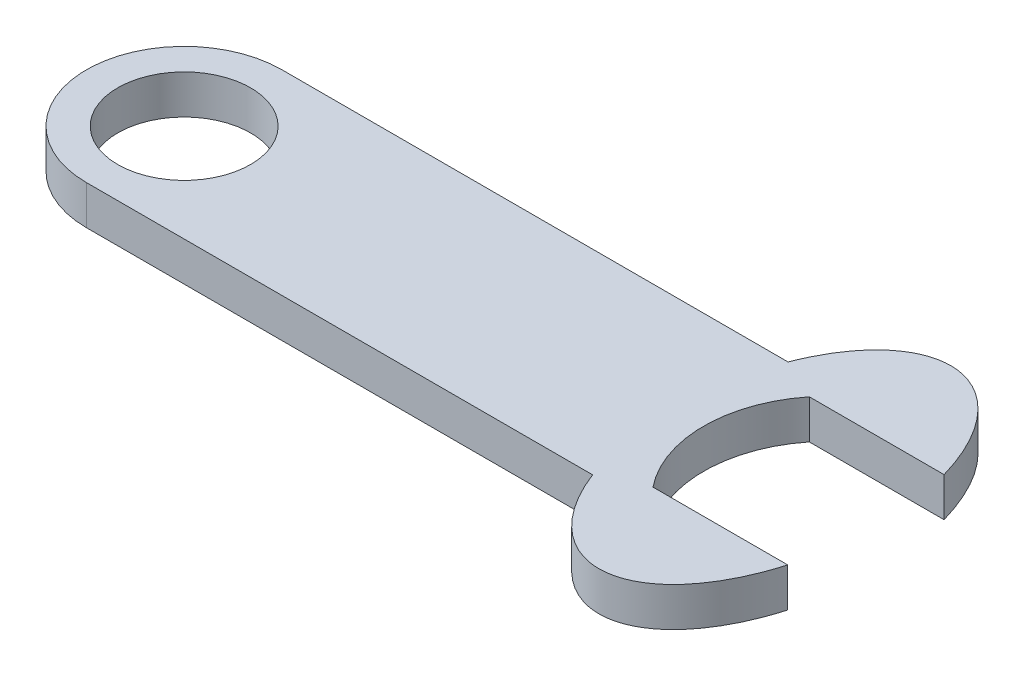
ISO-10303-21;
HEADER;
FILE_DESCRIPTION(('STEP AP214'),'2;1');
FILE_NAME('part.step','',(''),(''),'','','');
FILE_SCHEMA(('AUTOMOTIVE_DESIGN { 1 0 10303 214 1 1 1 1 }'));
ENDSEC;
DATA;
#1=APPLICATION_CONTEXT('core data for automotive mechanical design processes');
#2=APPLICATION_PROTOCOL_DEFINITION('international standard','automotive_design',2000,#1);
#3=PRODUCT_CONTEXT('',#1,'mechanical');
#4=PRODUCT('Part','Part','',(#3));
#5=PRODUCT_RELATED_PRODUCT_CATEGORY('part','',(#4));
#6=PRODUCT_DEFINITION_FORMATION('','',#4);
#7=PRODUCT_DEFINITION_CONTEXT('part definition',#1,'design');
#8=PRODUCT_DEFINITION('design','',#6,#7);
#9=PRODUCT_DEFINITION_SHAPE('','',#8);
#10=(LENGTH_UNIT() NAMED_UNIT(*) SI_UNIT(.MILLI.,.METRE.));
#11=(NAMED_UNIT(*) PLANE_ANGLE_UNIT() SI_UNIT($,.RADIAN.));
#12=(NAMED_UNIT(*) SI_UNIT($,.STERADIAN.) SOLID_ANGLE_UNIT());
#13=UNCERTAINTY_MEASURE_WITH_UNIT(LENGTH_MEASURE(1.E-05),#10,'distance_accuracy_value','');
#14=(GEOMETRIC_REPRESENTATION_CONTEXT(3) GLOBAL_UNCERTAINTY_ASSIGNED_CONTEXT((#13)) GLOBAL_UNIT_ASSIGNED_CONTEXT((#10,
#11,#12)) REPRESENTATION_CONTEXT('',''));
#15=CARTESIAN_POINT('',(0.,0.,0.));
#16=DIRECTION('',(0.,0.,1.));
#17=DIRECTION('',(1.,0.,0.));
#18=AXIS2_PLACEMENT_3D('',#15,#16,#17);
#19=CARTESIAN_POINT('',(0.,10.,0.));
#20=DIRECTION('',(0.,1.,0.));
#21=DIRECTION('',(0.,0.,1.));
#22=AXIS2_PLACEMENT_3D('',#19,#20,#21);
#23=PLANE('',#22);
#24=CARTESIAN_POINT('',(0.,10.,0.));
#25=DIRECTION('',(0.,1.,0.));
#26=DIRECTION('',(0.,0.,1.));
#27=AXIS2_PLACEMENT_3D('',#24,#25,#26);
#28=ELLIPSE('',#27,45.,26.);
#29=CARTESIAN_POINT('',(-21.6184649013605,10.,25.));
#30=VERTEX_POINT('',#29);
#31=CARTESIAN_POINT('',(23.290966828418,10.,20.));
#32=VERTEX_POINT('',#31);
#33=EDGE_CURVE('E152',#30,#32,#28,.T.);
#34=ORIENTED_EDGE('',*,*,#33,.T.);
#35=DIRECTION('',(-1.,0.,0.));
#36=VECTOR('',#35,1.);
#37=CARTESIAN_POINT('',(-11.1799919935936,10.,20.));
#38=LINE('',#37,#36);
#39=CARTESIAN_POINT('',(-11.1799919935936,10.,20.));
#40=VERTEX_POINT('',#39);
#41=EDGE_CURVE('E100',#32,#40,#38,.T.);
#42=ORIENTED_EDGE('',*,*,#41,.T.);
#43=CARTESIAN_POINT('',(13.8,10.,0.));
#44=DIRECTION('',(0.,-1.,0.));
#45=DIRECTION('',(0.,0.,1.));
#46=AXIS2_PLACEMENT_3D('',#43,#44,#45);
#47=CIRCLE('',#46,32.);
#48=CARTESIAN_POINT('',(-11.1799919935936,10.,-20.));
#49=VERTEX_POINT('',#48);
#50=EDGE_CURVE('E167',#40,#49,#47,.T.);
#51=ORIENTED_EDGE('',*,*,#50,.T.);
#52=DIRECTION('',(1.,0.,0.));
#53=VECTOR('',#52,1.);
#54=CARTESIAN_POINT('',(-11.1799919935936,10.,-20.));
#55=LINE('',#54,#53);
#56=CARTESIAN_POINT('',(23.290966828418,10.,-20.));
#57=VERTEX_POINT('',#56);
#58=EDGE_CURVE('E180',#49,#57,#55,.T.);
#59=ORIENTED_EDGE('',*,*,#58,.T.);
#60=CARTESIAN_POINT('',(0.,10.,0.));
#61=DIRECTION('',(0.,1.,0.));
#62=DIRECTION('',(0.,0.,1.));
#63=AXIS2_PLACEMENT_3D('',#60,#61,#62);
#64=ELLIPSE('',#63,45.,26.);
#65=CARTESIAN_POINT('',(-21.6184649013605,10.,-25.));
#66=VERTEX_POINT('',#65);
#67=EDGE_CURVE('E119',#57,#66,#64,.T.);
#68=ORIENTED_EDGE('',*,*,#67,.T.);
#69=DIRECTION('',(-1.,0.,0.));
#70=VECTOR('',#69,1.);
#71=CARTESIAN_POINT('',(-151.1,10.,-25.));
#72=LINE('',#71,#70);
#73=CARTESIAN_POINT('',(-151.1,10.,-25.));
#74=VERTEX_POINT('',#73);
#75=EDGE_CURVE('E113',#66,#74,#72,.T.);
#76=ORIENTED_EDGE('',*,*,#75,.T.);
#77=CARTESIAN_POINT('',(-151.1,10.,0.));
#78=DIRECTION('',(0.,1.,0.));
#79=DIRECTION('',(0.,0.,1.));
#80=AXIS2_PLACEMENT_3D('',#77,#78,#79);
#81=CIRCLE('',#80,25.);
#82=CARTESIAN_POINT('',(-151.1,10.,25.));
#83=VERTEX_POINT('',#82);
#84=EDGE_CURVE('E117',#74,#83,#81,.T.);
#85=ORIENTED_EDGE('',*,*,#84,.T.);
#86=DIRECTION('',(1.,0.,0.));
#87=VECTOR('',#86,1.);
#88=CARTESIAN_POINT('',(-151.1,10.,25.));
#89=LINE('',#88,#87);
#90=EDGE_CURVE('E57',#83,#30,#89,.T.);
#91=ORIENTED_EDGE('',*,*,#90,.T.);
#92=EDGE_LOOP('',(#34,#42,#51,#59,#68,#76,#85,#91));
#93=FACE_BOUND('',#92,.T.);
#94=CARTESIAN_POINT('',(-151.1,10.,0.));
#95=DIRECTION('',(0.,1.,0.));
#96=DIRECTION('',(0.,0.,1.));
#97=AXIS2_PLACEMENT_3D('',#94,#95,#96);
#98=CIRCLE('',#97,17.);
#99=CARTESIAN_POINT('',(-151.1,10.,17.));
#100=VERTEX_POINT('',#99);
#101=EDGE_CURVE('E141',#100,#100,#98,.T.);
#102=ORIENTED_EDGE('',*,*,#101,.F.);
#103=EDGE_LOOP('',(#102));
#104=FACE_BOUND('',#103,.T.);
#105=ADVANCED_FACE('F39',(#93,#104),#23,.T.);
#106=CARTESIAN_POINT('',(0.,0.,0.));
#107=DIRECTION('',(0.,1.,0.));
#108=DIRECTION('',(0.,0.,1.));
#109=AXIS2_PLACEMENT_3D('',#106,#107,#108);
#110=PLANE('',#109);
#111=CARTESIAN_POINT('',(0.,0.,0.));
#112=DIRECTION('',(0.,1.,0.));
#113=DIRECTION('',(0.,0.,1.));
#114=AXIS2_PLACEMENT_3D('',#111,#112,#113);
#115=ELLIPSE('',#114,45.,26.);
#116=CARTESIAN_POINT('',(-21.6184649013605,0.,25.));
#117=VERTEX_POINT('',#116);
#118=CARTESIAN_POINT('',(23.290966828418,0.,20.));
#119=VERTEX_POINT('',#118);
#120=EDGE_CURVE('E137',#117,#119,#115,.T.);
#121=ORIENTED_EDGE('',*,*,#120,.F.);
#122=DIRECTION('',(1.,0.,0.));
#123=VECTOR('',#122,1.);
#124=CARTESIAN_POINT('',(-151.1,0.,25.));
#125=LINE('',#124,#123);
#126=CARTESIAN_POINT('',(-151.1,0.,25.));
#127=VERTEX_POINT('',#126);
#128=EDGE_CURVE('E92',#127,#117,#125,.T.);
#129=ORIENTED_EDGE('',*,*,#128,.F.);
#130=CARTESIAN_POINT('',(-151.1,0.,0.));
#131=DIRECTION('',(0.,1.,0.));
#132=DIRECTION('',(0.,0.,1.));
#133=AXIS2_PLACEMENT_3D('',#130,#131,#132);
#134=CIRCLE('',#133,25.);
#135=CARTESIAN_POINT('',(-151.1,0.,-25.));
#136=VERTEX_POINT('',#135);
#137=EDGE_CURVE('E86',#136,#127,#134,.T.);
#138=ORIENTED_EDGE('',*,*,#137,.F.);
#139=DIRECTION('',(-1.,0.,0.));
#140=VECTOR('',#139,1.);
#141=CARTESIAN_POINT('',(-151.1,0.,-25.));
#142=LINE('',#141,#140);
#143=CARTESIAN_POINT('',(-21.6184649013605,0.,-25.));
#144=VERTEX_POINT('',#143);
#145=EDGE_CURVE('E127',#144,#136,#142,.T.);
#146=ORIENTED_EDGE('',*,*,#145,.F.);
#147=CARTESIAN_POINT('',(0.,0.,0.));
#148=DIRECTION('',(0.,1.,0.));
#149=DIRECTION('',(0.,0.,1.));
#150=AXIS2_PLACEMENT_3D('',#147,#148,#149);
#151=ELLIPSE('',#150,45.,26.);
#152=CARTESIAN_POINT('',(23.290966828418,0.,-20.));
#153=VERTEX_POINT('',#152);
#154=EDGE_CURVE('E147',#153,#144,#151,.T.);
#155=ORIENTED_EDGE('',*,*,#154,.F.);
#156=DIRECTION('',(1.,0.,0.));
#157=VECTOR('',#156,1.);
#158=CARTESIAN_POINT('',(-11.1799919935936,0.,-20.));
#159=LINE('',#158,#157);
#160=CARTESIAN_POINT('',(-11.1799919935936,0.,-20.));
#161=VERTEX_POINT('',#160);
#162=EDGE_CURVE('E145',#161,#153,#159,.T.);
#163=ORIENTED_EDGE('',*,*,#162,.F.);
#164=CARTESIAN_POINT('',(13.8,0.,0.));
#165=DIRECTION('',(0.,-1.,0.));
#166=DIRECTION('',(0.,0.,1.));
#167=AXIS2_PLACEMENT_3D('',#164,#165,#166);
#168=CIRCLE('',#167,32.);
#169=CARTESIAN_POINT('',(-11.1799919935936,0.,20.));
#170=VERTEX_POINT('',#169);
#171=EDGE_CURVE('E143',#170,#161,#168,.T.);
#172=ORIENTED_EDGE('',*,*,#171,.F.);
#173=DIRECTION('',(-1.,0.,0.));
#174=VECTOR('',#173,1.);
#175=CARTESIAN_POINT('',(-11.1799919935936,0.,20.));
#176=LINE('',#175,#174);
#177=EDGE_CURVE('E140',#119,#170,#176,.T.);
#178=ORIENTED_EDGE('',*,*,#177,.F.);
#179=EDGE_LOOP('',(#121,#129,#138,#146,#155,#163,#172,#178));
#180=FACE_BOUND('',#179,.T.);
#181=CARTESIAN_POINT('',(-151.1,0.,0.));
#182=DIRECTION('',(0.,1.,0.));
#183=DIRECTION('',(0.,0.,1.));
#184=AXIS2_PLACEMENT_3D('',#181,#182,#183);
#185=CIRCLE('',#184,17.);
#186=CARTESIAN_POINT('',(-151.1,0.,17.));
#187=VERTEX_POINT('',#186);
#188=EDGE_CURVE('E280',#187,#187,#185,.T.);
#189=ORIENTED_EDGE('',*,*,#188,.T.);
#190=EDGE_LOOP('',(#189));
#191=FACE_BOUND('',#190,.T.);
#192=ADVANCED_FACE('F171',(#180,#191),#110,.F.);
#193=DIRECTION('',(0.,-1.,0.));
#194=VECTOR('',#193,1.);
#195=SURFACE_OF_LINEAR_EXTRUSION('',#28,#194);
#196=ORIENTED_EDGE('',*,*,#120,.T.);
#197=DIRECTION('',(0.,-1.,0.));
#198=VECTOR('',#197,1.);
#199=CARTESIAN_POINT('',(23.290966828418,10.,20.));
#200=LINE('',#199,#198);
#201=EDGE_CURVE('E11',#32,#119,#200,.T.);
#202=ORIENTED_EDGE('',*,*,#201,.F.);
#203=ORIENTED_EDGE('',*,*,#33,.F.);
#204=DIRECTION('',(0.,-1.,0.));
#205=VECTOR('',#204,1.);
#206=CARTESIAN_POINT('',(-21.6184649013605,10.,25.));
#207=LINE('',#206,#205);
#208=EDGE_CURVE('E133',#30,#117,#207,.T.);
#209=ORIENTED_EDGE('',*,*,#208,.T.);
#210=EDGE_LOOP('',(#196,#202,#203,#209));
#211=FACE_BOUND('',#210,.T.);
#212=ADVANCED_FACE('F41',(#211),#195,.F.);
#213=CARTESIAN_POINT('',(-11.1799919935936,10.,20.));
#214=DIRECTION('',(0.,0.,1.));
#215=DIRECTION('',(1.,0.,0.));
#216=AXIS2_PLACEMENT_3D('',#213,#214,#215);
#217=PLANE('',#216);
#218=ORIENTED_EDGE('',*,*,#177,.T.);
#219=DIRECTION('',(0.,-1.,0.));
#220=VECTOR('',#219,1.);
#221=CARTESIAN_POINT('',(-11.1799919935936,10.,20.));
#222=LINE('',#221,#220);
#223=EDGE_CURVE('E49',#40,#170,#222,.T.);
#224=ORIENTED_EDGE('',*,*,#223,.F.);
#225=ORIENTED_EDGE('',*,*,#41,.F.);
#226=ORIENTED_EDGE('',*,*,#201,.T.);
#227=EDGE_LOOP('',(#218,#224,#225,#226));
#228=FACE_BOUND('',#227,.T.);
#229=ADVANCED_FACE('F192',(#228),#217,.F.);
#230=CARTESIAN_POINT('',(13.8,10.,0.));
#231=DIRECTION('',(0.,-1.,0.));
#232=DIRECTION('',(0.,0.,-1.));
#233=AXIS2_PLACEMENT_3D('',#230,#231,#232);
#234=CYLINDRICAL_SURFACE('',#233,32.);
#235=ORIENTED_EDGE('',*,*,#171,.T.);
#236=DIRECTION('',(0.,-1.,0.));
#237=VECTOR('',#236,1.);
#238=CARTESIAN_POINT('',(-11.1799919935936,10.,-20.));
#239=LINE('',#238,#237);
#240=EDGE_CURVE('E159',#49,#161,#239,.T.);
#241=ORIENTED_EDGE('',*,*,#240,.F.);
#242=ORIENTED_EDGE('',*,*,#50,.F.);
#243=ORIENTED_EDGE('',*,*,#223,.T.);
#244=EDGE_LOOP('',(#235,#241,#242,#243));
#245=FACE_BOUND('',#244,.T.);
#246=ADVANCED_FACE('F165',(#245),#234,.F.);
#247=CARTESIAN_POINT('',(-11.1799919935936,10.,-20.));
#248=DIRECTION('',(0.,0.,-1.));
#249=DIRECTION('',(-1.,0.,0.));
#250=AXIS2_PLACEMENT_3D('',#247,#248,#249);
#251=PLANE('',#250);
#252=ORIENTED_EDGE('',*,*,#162,.T.);
#253=DIRECTION('',(0.,-1.,0.));
#254=VECTOR('',#253,1.);
#255=CARTESIAN_POINT('',(23.290966828418,10.,-20.));
#256=LINE('',#255,#254);
#257=EDGE_CURVE('E156',#57,#153,#256,.T.);
#258=ORIENTED_EDGE('',*,*,#257,.F.);
#259=ORIENTED_EDGE('',*,*,#58,.F.);
#260=ORIENTED_EDGE('',*,*,#240,.T.);
#261=EDGE_LOOP('',(#252,#258,#259,#260));
#262=FACE_BOUND('',#261,.T.);
#263=ADVANCED_FACE('F176',(#262),#251,.F.);
#264=DIRECTION('',(0.,-1.,0.));
#265=VECTOR('',#264,1.);
#266=SURFACE_OF_LINEAR_EXTRUSION('',#64,#265);
#267=ORIENTED_EDGE('',*,*,#154,.T.);
#268=DIRECTION('',(0.,-1.,0.));
#269=VECTOR('',#268,1.);
#270=CARTESIAN_POINT('',(-21.6184649013605,10.,-25.));
#271=LINE('',#270,#269);
#272=EDGE_CURVE('E128',#66,#144,#271,.T.);
#273=ORIENTED_EDGE('',*,*,#272,.F.);
#274=ORIENTED_EDGE('',*,*,#67,.F.);
#275=ORIENTED_EDGE('',*,*,#257,.T.);
#276=EDGE_LOOP('',(#267,#273,#274,#275));
#277=FACE_BOUND('',#276,.T.);
#278=ADVANCED_FACE('F179',(#277),#266,.F.);
#279=CARTESIAN_POINT('',(-151.1,10.,-25.));
#280=DIRECTION('',(0.,0.,1.));
#281=DIRECTION('',(1.,0.,0.));
#282=AXIS2_PLACEMENT_3D('',#279,#280,#281);
#283=PLANE('',#282);
#284=ORIENTED_EDGE('',*,*,#145,.T.);
#285=DIRECTION('',(0.,-1.,0.));
#286=VECTOR('',#285,1.);
#287=CARTESIAN_POINT('',(-151.1,10.,-25.));
#288=LINE('',#287,#286);
#289=EDGE_CURVE('E124',#74,#136,#288,.T.);
#290=ORIENTED_EDGE('',*,*,#289,.F.);
#291=ORIENTED_EDGE('',*,*,#75,.F.);
#292=ORIENTED_EDGE('',*,*,#272,.T.);
#293=EDGE_LOOP('',(#284,#290,#291,#292));
#294=FACE_BOUND('',#293,.T.);
#295=ADVANCED_FACE('F125',(#294),#283,.F.);
#296=CARTESIAN_POINT('',(-151.1,10.,0.));
#297=DIRECTION('',(0.,-1.,0.));
#298=DIRECTION('',(0.,0.,-1.));
#299=AXIS2_PLACEMENT_3D('',#296,#297,#298);
#300=CYLINDRICAL_SURFACE('',#299,25.);
#301=ORIENTED_EDGE('',*,*,#137,.T.);
#302=DIRECTION('',(0.,-1.,0.));
#303=VECTOR('',#302,1.);
#304=CARTESIAN_POINT('',(-151.1,10.,25.));
#305=LINE('',#304,#303);
#306=EDGE_CURVE('E129',#83,#127,#305,.T.);
#307=ORIENTED_EDGE('',*,*,#306,.F.);
#308=ORIENTED_EDGE('',*,*,#84,.F.);
#309=ORIENTED_EDGE('',*,*,#289,.T.);
#310=EDGE_LOOP('',(#301,#307,#308,#309));
#311=FACE_BOUND('',#310,.T.);
#312=ADVANCED_FACE('F131',(#311),#300,.T.);
#313=CARTESIAN_POINT('',(-151.1,10.,25.));
#314=DIRECTION('',(0.,0.,-1.));
#315=DIRECTION('',(-1.,0.,0.));
#316=AXIS2_PLACEMENT_3D('',#313,#314,#315);
#317=PLANE('',#316);
#318=ORIENTED_EDGE('',*,*,#128,.T.);
#319=ORIENTED_EDGE('',*,*,#208,.F.);
#320=ORIENTED_EDGE('',*,*,#90,.F.);
#321=ORIENTED_EDGE('',*,*,#306,.T.);
#322=EDGE_LOOP('',(#318,#319,#320,#321));
#323=FACE_BOUND('',#322,.T.);
#324=ADVANCED_FACE('F207',(#323),#317,.F.);
#325=CARTESIAN_POINT('',(-151.1,10.,0.));
#326=DIRECTION('',(0.,-1.,0.));
#327=DIRECTION('',(0.,0.,-1.));
#328=AXIS2_PLACEMENT_3D('',#325,#326,#327);
#329=CYLINDRICAL_SURFACE('',#328,17.);
#330=ORIENTED_EDGE('',*,*,#101,.T.);
#331=EDGE_LOOP('',(#330));
#332=FACE_BOUND('',#331,.T.);
#333=ORIENTED_EDGE('',*,*,#188,.F.);
#334=EDGE_LOOP('',(#333));
#335=FACE_BOUND('',#334,.T.);
#336=ADVANCED_FACE('F205',(#332,#335),#329,.F.);
#337=CLOSED_SHELL('',(#105,#192,#212,#229,#246,#263,#278,#295,#312,#324,#336));
#338=MANIFOLD_SOLID_BREP('B2',#337);
#339=ADVANCED_BREP_SHAPE_REPRESENTATION('',(#18,#338),#14);
#340=SHAPE_DEFINITION_REPRESENTATION(#9,#339);
ENDSEC;
END-ISO-10303-21;
